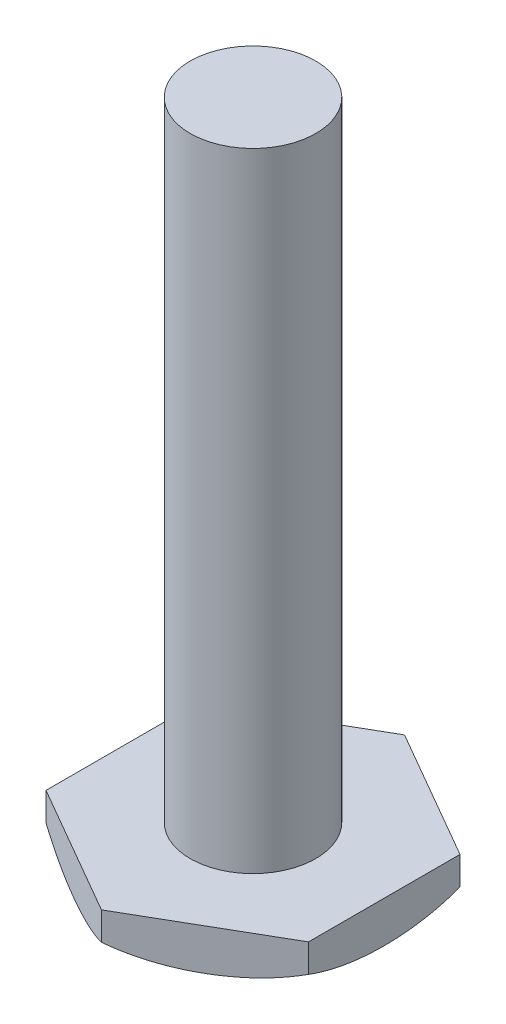
ISO-10303-21;
HEADER;
FILE_DESCRIPTION(('STEP AP214'),'2;1');
FILE_NAME('part.step','',(''),(''),'','','');
FILE_SCHEMA(('AUTOMOTIVE_DESIGN { 1 0 10303 214 1 1 1 1 }'));
ENDSEC;
DATA;
#1=APPLICATION_CONTEXT('core data for automotive mechanical design processes');
#2=APPLICATION_PROTOCOL_DEFINITION('international standard','automotive_design',2000,#1);
#3=PRODUCT_CONTEXT('',#1,'mechanical');
#4=PRODUCT('Part','Part','',(#3));
#5=PRODUCT_RELATED_PRODUCT_CATEGORY('part','',(#4));
#6=PRODUCT_DEFINITION_FORMATION('','',#4);
#7=PRODUCT_DEFINITION_CONTEXT('part definition',#1,'design');
#8=PRODUCT_DEFINITION('design','',#6,#7);
#9=PRODUCT_DEFINITION_SHAPE('','',#8);
#10=(LENGTH_UNIT() NAMED_UNIT(*) SI_UNIT(.MILLI.,.METRE.));
#11=(NAMED_UNIT(*) PLANE_ANGLE_UNIT() SI_UNIT($,.RADIAN.));
#12=(NAMED_UNIT(*) SI_UNIT($,.STERADIAN.) SOLID_ANGLE_UNIT());
#13=UNCERTAINTY_MEASURE_WITH_UNIT(LENGTH_MEASURE(1.E-05),#10,'distance_accuracy_value','');
#14=(GEOMETRIC_REPRESENTATION_CONTEXT(3) GLOBAL_UNCERTAINTY_ASSIGNED_CONTEXT((#13)) GLOBAL_UNIT_ASSIGNED_CONTEXT((#10,
#11,#12)) REPRESENTATION_CONTEXT('',''));
#15=CARTESIAN_POINT('',(0.,0.,0.));
#16=DIRECTION('',(0.,0.,1.));
#17=DIRECTION('',(1.,0.,0.));
#18=AXIS2_PLACEMENT_3D('',#15,#16,#17);
#19=CARTESIAN_POINT('',(4.97289269438832,-14.1867870187384,0.));
#20=DIRECTION('',(0.,1.,0.));
#21=DIRECTION('',(-1.,0.,0.));
#22=AXIS2_PLACEMENT_3D('',#19,#20,#21);
#23=PLANE('',#22);
#24=CARTESIAN_POINT('',(20.2954426943877,-14.1867870187385,0.));
#25=DIRECTION('',(0.,1.,0.));
#26=DIRECTION('',(-1.,0.,0.));
#27=AXIS2_PLACEMENT_3D('',#24,#25,#26);
#28=CIRCLE('',#27,6.34999999999999);
#29=CARTESIAN_POINT('',(13.9454426943877,-14.1867870187384,0.));
#30=VERTEX_POINT('',#29);
#31=EDGE_CURVE('E118',#30,#30,#28,.T.);
#32=ORIENTED_EDGE('',*,*,#31,.F.);
#33=EDGE_LOOP('',(#32));
#34=FACE_BOUND('',#33,.T.);
#35=DIRECTION('',(0.866025403784439,0.,0.499999999999999));
#36=VECTOR('',#35,1.);
#37=CARTESIAN_POINT('',(2.16890478972675,-14.1867870187384,4.85664951468244));
#38=LINE('',#37,#36);
#39=CARTESIAN_POINT('',(7.02619188506488,-14.1867870187385,7.6610055267072));
#40=VERTEX_POINT('',#39);
#41=CARTESIAN_POINT('',(20.2954426943883,-14.1867870187385,15.3220110534147));
#42=VERTEX_POINT('',#41);
#43=EDGE_CURVE('E87',#40,#42,#38,.T.);
#44=ORIENTED_EDGE('',*,*,#43,.T.);
#45=DIRECTION('',(0.866025403784439,0.,-0.5));
#46=VECTOR('',#45,1.);
#47=CARTESIAN_POINT('',(15.4381555990496,-14.1867870187385,18.1263670654392));
#48=LINE('',#47,#46);
#49=CARTESIAN_POINT('',(33.5646935037106,-14.1867870187386,7.66100552670717));
#50=VERTEX_POINT('',#49);
#51=EDGE_CURVE('E116',#42,#50,#48,.T.);
#52=ORIENTED_EDGE('',*,*,#51,.T.);
#53=DIRECTION('',(0.,0.,-1.));
#54=VECTOR('',#53,1.);
#55=CARTESIAN_POINT('',(33.5646935037106,-14.1867870187386,0.));
#56=LINE('',#55,#54);
#57=CARTESIAN_POINT('',(33.5646935037106,-14.1867870187386,-7.66100552670721));
#58=VERTEX_POINT('',#57);
#59=EDGE_CURVE('E113',#50,#58,#56,.T.);
#60=ORIENTED_EDGE('',*,*,#59,.T.);
#61=DIRECTION('',(-0.86602540378444,0.,-0.499999999999997));
#62=VECTOR('',#61,1.);
#63=CARTESIAN_POINT('',(15.4381555990495,-14.1867870187385,-18.1263670654392));
#64=LINE('',#63,#62);
#65=CARTESIAN_POINT('',(20.2954426943877,-14.1867870187385,-15.3220110534144));
#66=VERTEX_POINT('',#65);
#67=EDGE_CURVE('E108',#58,#66,#64,.T.);
#68=ORIENTED_EDGE('',*,*,#67,.T.);
#69=DIRECTION('',(-0.866025403784438,0.,0.500000000000001));
#70=VECTOR('',#69,1.);
#71=CARTESIAN_POINT('',(2.16890478972675,-14.1867870187384,-4.85664951468241));
#72=LINE('',#71,#70);
#73=CARTESIAN_POINT('',(7.02619188506488,-14.1867870187384,-7.66100552670718));
#74=VERTEX_POINT('',#73);
#75=EDGE_CURVE('E106',#66,#74,#72,.T.);
#76=ORIENTED_EDGE('',*,*,#75,.T.);
#77=DIRECTION('',(0.,0.,1.));
#78=VECTOR('',#77,1.);
#79=CARTESIAN_POINT('',(7.02619188506488,-14.1867870187384,0.));
#80=LINE('',#79,#78);
#81=EDGE_CURVE('E92',#74,#40,#80,.T.);
#82=ORIENTED_EDGE('',*,*,#81,.T.);
#83=EDGE_LOOP('',(#44,#52,#60,#68,#76,#82));
#84=FACE_BOUND('',#83,.T.);
#85=ADVANCED_FACE('F34',(#34,#84),#23,.T.);
#86=CARTESIAN_POINT('',(13.9454426943877,49.3132129812616,0.));
#87=DIRECTION('',(0.,1.,0.));
#88=DIRECTION('',(-1.,0.,0.));
#89=AXIS2_PLACEMENT_3D('',#86,#87,#88);
#90=PLANE('',#89);
#91=CARTESIAN_POINT('',(20.2954426943883,49.3132129812615,0.));
#92=DIRECTION('',(0.,1.,0.));
#93=DIRECTION('',(-1.,0.,0.));
#94=AXIS2_PLACEMENT_3D('',#91,#92,#93);
#95=CIRCLE('',#94,6.3500000000006);
#96=CARTESIAN_POINT('',(13.9454426943877,49.3132129812616,0.));
#97=VERTEX_POINT('',#96);
#98=EDGE_CURVE('E121',#97,#97,#95,.T.);
#99=ORIENTED_EDGE('',*,*,#98,.T.);
#100=EDGE_LOOP('',(#99));
#101=FACE_BOUND('',#100,.T.);
#102=ADVANCED_FACE('F154',(#101),#90,.T.);
#103=CARTESIAN_POINT('',(20.2954426943883,49.3132129812616,0.));
#104=DIRECTION('',(0.,1.,0.));
#105=DIRECTION('',(-1.,0.,0.));
#106=AXIS2_PLACEMENT_3D('',#103,#104,#105);
#107=CYLINDRICAL_SURFACE('',#106,6.35000000000007);
#108=ORIENTED_EDGE('',*,*,#31,.T.);
#109=EDGE_LOOP('',(#108));
#110=FACE_BOUND('',#109,.T.);
#111=ORIENTED_EDGE('',*,*,#98,.F.);
#112=EDGE_LOOP('',(#111));
#113=FACE_BOUND('',#112,.T.);
#114=ADVANCED_FACE('F150',(#110,#113),#107,.T.);
#115=CARTESIAN_POINT('',(33.5646935037112,49.3132129812616,7.66100552670717));
#116=DIRECTION('',(0.5,0.,0.866025403784439));
#117=DIRECTION('',(0.866025403784439,0.,-0.5));
#118=AXIS2_PLACEMENT_3D('',#115,#116,#117);
#119=PLANE('',#118);
#120=DIRECTION('',(0.,-1.,0.));
#121=VECTOR('',#120,1.);
#122=CARTESIAN_POINT('',(20.2954426943883,49.3132129812617,15.3220110534144));
#123=LINE('',#122,#121);
#124=CARTESIAN_POINT('',(20.2954426943877,-17.0319966537057,15.3220110534144));
#125=VERTEX_POINT('',#124);
#126=EDGE_CURVE('E52',#42,#125,#123,.T.);
#127=ORIENTED_EDGE('',*,*,#126,.T.);
#128=CARTESIAN_POINT('',(33.5648935037112,-17.0319088909307,7.66089005665297));
#129=CARTESIAN_POINT('',(33.111823366917,-17.2307190477961,7.92247022209291));
#130=CARTESIAN_POINT('',(32.6509930388295,-17.4047294242662,8.18853073606493));
#131=CARTESIAN_POINT('',(31.7186770752691,-17.7061782382809,8.72680360859633));
#132=CARTESIAN_POINT('',(31.2472070464806,-17.8336807093711,8.99900695663221));
#133=CARTESIAN_POINT('',(30.2946661346574,-18.0462385829953,9.54895670848744));
#134=CARTESIAN_POINT('',(29.8135574424734,-18.131063827805,9.82672494142937));
#135=CARTESIAN_POINT('',(28.8471225371761,-18.2602486282798,10.384696394157));
#136=CARTESIAN_POINT('',(28.3617945737427,-18.3045904934179,10.6649006244906));
#137=CARTESIAN_POINT('',(27.3644109215039,-18.3559024314909,11.240740344596));
#138=CARTESIAN_POINT('',(26.852276339606,-18.3608117101938,11.536421383316));
#139=CARTESIAN_POINT('',(25.8289644626214,-18.3280862638972,12.127230770958));
#140=CARTESIAN_POINT('',(25.3177872526707,-18.2904479199188,12.4223590707267));
#141=CARTESIAN_POINT('',(24.3009061515079,-18.1710308689775,13.0094556482168));
#142=CARTESIAN_POINT('',(23.7951900526525,-18.0893923458226,13.3014309740245));
#143=CARTESIAN_POINT('',(22.7912341035226,-17.8788105950527,13.8810652115092));
#144=CARTESIAN_POINT('',(22.292991131774,-17.749887724861,14.1687259253701));
#145=CARTESIAN_POINT('',(21.546124053047,-17.5155147147188,14.599929834322));
#146=CARTESIAN_POINT('',(21.2930399553977,-17.4287473709035,14.7460480062274));
#147=CARTESIAN_POINT('',(20.7909367430956,-17.2410658142445,15.035937431011));
#148=CARTESIAN_POINT('',(20.5419162867765,-17.1401563806084,15.1797094585006));
#149=CARTESIAN_POINT('',(20.2952426943877,-17.0319088909309,15.3221265234682));
#150=B_SPLINE_CURVE_WITH_KNOTS('',3,(#128,#129,#130,#131,#132,#133,#134,#135,#136,#137,#138,
#139,#140,#141,#142,#143,#144,#145,#146,#147,#148,#149),.UNSPECIFIED.,.F.,.F.,(4,2,2,2,2,2,2,2,
2,2,4),(0.,1.67773954982324,3.35316033717958,5.03752230962399,6.72261996692063,8.49524478686033,
10.2680203925355,12.0351810678027,13.8015818152875,14.7157932843279,15.6296965444941),.UNSPECIFIED.);
#151=CARTESIAN_POINT('',(33.5646935037106,-17.0319966536976,7.66100552670717));
#152=VERTEX_POINT('',#151);
#153=EDGE_CURVE('E12',#152,#125,#150,.T.);
#154=ORIENTED_EDGE('',*,*,#153,.F.);
#155=DIRECTION('',(0.,-1.,0.));
#156=VECTOR('',#155,1.);
#157=CARTESIAN_POINT('',(33.5646935037112,49.3132129812616,7.66100552670717));
#158=LINE('',#157,#156);
#159=EDGE_CURVE('E93',#50,#152,#158,.T.);
#160=ORIENTED_EDGE('',*,*,#159,.F.);
#161=ORIENTED_EDGE('',*,*,#51,.F.);
#162=EDGE_LOOP('',(#127,#154,#160,#161));
#163=FACE_BOUND('',#162,.T.);
#164=ADVANCED_FACE('F145',(#163),#119,.T.);
#165=CARTESIAN_POINT('',(33.5646935037112,49.3132129812616,-7.66100552670721));
#166=DIRECTION('',(1.,0.,0.));
#167=DIRECTION('',(0.,1.,0.));
#168=AXIS2_PLACEMENT_3D('',#165,#166,#167);
#169=PLANE('',#168);
#170=ORIENTED_EDGE('',*,*,#159,.T.);
#171=CARTESIAN_POINT('',(33.5646935037106,-18.3538652307431,0.));
#172=CARTESIAN_POINT('',(33.5646935037106,-18.3538686357167,0.598536424461198));
#173=CARTESIAN_POINT('',(33.5646935037106,-18.3321294210898,1.19709922839585));
#174=CARTESIAN_POINT('',(33.5646935037106,-18.2440923495477,2.39104971638389));
#175=CARTESIAN_POINT('',(33.5646935037106,-18.1777878298826,2.98643691224944));
#176=CARTESIAN_POINT('',(33.5646935037106,-17.9978378553961,4.16879992968116));
#177=CARTESIAN_POINT('',(33.5646935037106,-17.8843039146107,4.75579221777713));
#178=CARTESIAN_POINT('',(33.5646935037106,-17.6756740500726,5.62685106902979));
#179=CARTESIAN_POINT('',(33.5646935037106,-17.5997557288037,5.91559320906014));
#180=CARTESIAN_POINT('',(33.5646935037106,-17.4346161303988,6.48933609287663));
#181=CARTESIAN_POINT('',(33.5646935037106,-17.3453917086936,6.77433593489314));
#182=CARTESIAN_POINT('',(33.5646935037106,-17.1084446290652,7.47127577150616));
#183=CARTESIAN_POINT('',(33.5646935037106,-16.952821879466,7.88056788923095));
#184=CARTESIAN_POINT('',(33.5646935037106,-16.6108791475207,8.68603450438351));
#185=CARTESIAN_POINT('',(33.5646935037106,-16.424567005913,9.08221232137504));
#186=CARTESIAN_POINT('',(33.5646935037106,-16.0204880586943,9.85818032879326));
#187=CARTESIAN_POINT('',(33.5646935037106,-15.8027261871143,10.2379730776963));
#188=CARTESIAN_POINT('',(33.5646935037106,-15.3355376149767,10.9776258845504));
#189=CARTESIAN_POINT('',(33.5646935037106,-15.0861103246162,11.3374855710472));
#190=CARTESIAN_POINT('',(33.5646935037106,-14.5539151992156,12.0362876393734));
#191=CARTESIAN_POINT('',(33.5646935037106,-14.2708966407944,12.375039685945));
#192=CARTESIAN_POINT('',(33.5646935037106,-13.6743187698628,13.0245423473983));
#193=CARTESIAN_POINT('',(33.5646935037106,-13.360758555671,13.3352921350475));
#194=CARTESIAN_POINT('',(33.5646935037106,-12.7049641123741,13.9249387903882));
#195=CARTESIAN_POINT('',(33.5646935037106,-12.3627363881232,14.2038428503348));
#196=CARTESIAN_POINT('',(33.5646935037106,-11.8300126830844,14.5954931661809));
#197=CARTESIAN_POINT('',(33.5646935037106,-11.6492058393786,14.7215934468049));
#198=CARTESIAN_POINT('',(33.5646935037106,-11.2814084846498,14.9645630603408));
#199=CARTESIAN_POINT('',(33.5646935037106,-11.094416118217,15.0814295872137));
#200=CARTESIAN_POINT('',(33.5646935037106,-10.5720111938073,15.3896759966035));
#201=CARTESIAN_POINT('',(33.5646935037106,-10.2306346398662,15.5710753534488));
#202=CARTESIAN_POINT('',(33.5646935037107,-9.53290756820259,15.9021691846349));
#203=CARTESIAN_POINT('',(33.5646935037107,-9.17655834408352,16.0518663912446));
#204=CARTESIAN_POINT('',(33.5646935037107,-8.45178474047677,16.3178997779156));
#205=CARTESIAN_POINT('',(33.5646935037107,-8.08336609332564,16.434251546489));
#206=CARTESIAN_POINT('',(33.5646935037107,-7.33734772878062,16.6323734344121));
#207=CARTESIAN_POINT('',(33.5646935037107,-6.95974844467553,16.7141451824609));
#208=CARTESIAN_POINT('',(33.5646935037107,-6.22824164833974,16.8372037643435));
#209=CARTESIAN_POINT('',(33.5646935037107,-5.87477861389079,16.8811470737205));
#210=CARTESIAN_POINT('',(33.5646935037107,-5.16539315132727,16.9384292449644));
#211=CARTESIAN_POINT('',(33.5646935037107,-4.8094708770961,16.9517700046551));
#212=CARTESIAN_POINT('',(33.5646935037107,-4.09786664291392,16.9477203454122));
#213=CARTESIAN_POINT('',(33.5646935037107,-3.74218465172659,16.9303353256955));
#214=CARTESIAN_POINT('',(33.5646935037107,-3.03363620284627,16.865013736492));
#215=CARTESIAN_POINT('',(33.5646935037107,-2.68076974910853,16.817077124094));
#216=CARTESIAN_POINT('',(33.5646935037107,-1.98796514078884,16.6924695091963));
#217=CARTESIAN_POINT('',(33.5646935037107,-1.64791199122469,16.6164363883207));
#218=CARTESIAN_POINT('',(33.5646935037107,-0.975347172333934,16.4362635658281));
#219=CARTESIAN_POINT('',(33.5646935037107,-0.642835330905061,16.3321245063256));
#220=CARTESIAN_POINT('',(33.5646935037107,0.0124059834821114,16.0966925817958));
#221=CARTESIAN_POINT('',(33.5646935037107,0.33513592304754,15.9654010143168));
#222=CARTESIAN_POINT('',(33.5646935037107,0.968758336298564,15.6768360160698));
#223=CARTESIAN_POINT('',(33.5646935037107,1.27965059362848,15.5195621107064));
#224=CARTESIAN_POINT('',(33.5646935037108,1.89306533479723,15.177421940684));
#225=CARTESIAN_POINT('',(33.5646935037108,2.19534367191288,14.9921181551042));
#226=CARTESIAN_POINT('',(33.5646935037108,2.78391102773647,14.5976785116119));
#227=CARTESIAN_POINT('',(33.5646935037108,3.07019999366608,14.3885425750404));
#228=CARTESIAN_POINT('',(33.5646935037108,3.62531555880373,13.9482069080797));
#229=CARTESIAN_POINT('',(33.5646935037108,3.89413992691143,13.7170043679635));
#230=CARTESIAN_POINT('',(33.5646935037108,4.41307180743041,13.2344554111461));
#231=CARTESIAN_POINT('',(33.5646935037108,4.66317756689221,12.9831071123997));
#232=CARTESIAN_POINT('',(33.5646935037108,5.15823446640743,12.4465178221095));
#233=CARTESIAN_POINT('',(33.5646935037108,5.40196018996119,12.1601465064897));
#234=CARTESIAN_POINT('',(33.5646935037108,5.86650160543554,11.5694244323249));
#235=CARTESIAN_POINT('',(33.5646935037108,6.08731699382837,11.2650734356598));
#236=CARTESIAN_POINT('',(33.5646935037108,6.50560607453523,10.6408531955916));
#237=CARTESIAN_POINT('',(33.5646935037108,6.7030847830746,10.3209873080441));
#238=CARTESIAN_POINT('',(33.5646935037108,7.07474800124408,9.6679763629918));
#239=CARTESIAN_POINT('',(33.5646935037108,7.24892812282767,9.3348288193188));
#240=CARTESIAN_POINT('',(33.5646935037108,7.64042659330087,8.5196939903488));
#241=CARTESIAN_POINT('',(33.5646935037108,7.84648564361528,8.03226959963395));
#242=CARTESIAN_POINT('',(33.5646935037108,8.21475203770081,7.04111930821335));
#243=CARTESIAN_POINT('',(33.5646935037108,8.37694445200691,6.53738792276917));
#244=CARTESIAN_POINT('',(33.5646935037108,8.66039644623737,5.51689072574765));
#245=CARTESIAN_POINT('',(33.5646935037108,8.78152281602344,5.00008823042994));
#246=CARTESIAN_POINT('',(33.5646935037108,8.98496604700008,3.95881813879884));
#247=CARTESIAN_POINT('',(33.5646935037108,9.06727292648125,3.43434860675248));
#248=CARTESIAN_POINT('',(33.5646935037108,9.17204702624804,2.57392180098535));
#249=CARTESIAN_POINT('',(33.5646935037108,9.20539004028484,2.23923489244435));
#250=CARTESIAN_POINT('',(33.5646935037108,9.25792843017189,1.56882641378676));
#251=CARTESIAN_POINT('',(33.5646935037108,9.27712735357801,1.23310512433661));
#252=CARTESIAN_POINT('',(33.5646935037108,9.30169083667311,0.560998979671739));
#253=CARTESIAN_POINT('',(33.5646935037108,9.30704862172637,0.224613880129424));
#254=CARTESIAN_POINT('',(33.5646935037108,9.30399537901971,-0.448113081433974));
#255=CARTESIAN_POINT('',(33.5646935037108,9.295583511766,-0.784454939568472));
#256=CARTESIAN_POINT('',(33.5646935037108,9.26487645998682,-1.45606121586108));
#257=CARTESIAN_POINT('',(33.5646935037108,9.24260011611766,-1.79132647657691));
#258=CARTESIAN_POINT('',(33.5646935037108,9.1838485024483,-2.46057901330732));
#259=CARTESIAN_POINT('',(33.5646935037108,9.14737316778244,-2.79456628347657));
#260=CARTESIAN_POINT('',(33.5646935037108,9.01593859937922,-3.79332688396694));
#261=CARTESIAN_POINT('',(33.5646935037108,8.89894765948305,-4.45543971903742));
#262=CARTESIAN_POINT('',(33.5646935037108,8.64534072087922,-5.57002725888335));
#263=CARTESIAN_POINT('',(33.5646935037108,8.52492902219822,-6.02624459678219));
#264=CARTESIAN_POINT('',(33.5646935037108,8.25054754704098,-6.92855326604348));
#265=CARTESIAN_POINT('',(33.5646935037108,8.09658049576811,-7.37464541647799));
#266=CARTESIAN_POINT('',(33.5646935037108,7.75374887150279,-8.25229184582183));
#267=CARTESIAN_POINT('',(33.5646935037108,7.56495128939707,-8.68387218325877));
#268=CARTESIAN_POINT('',(33.5646935037108,7.15111909144505,-9.52933640342705));
#269=CARTESIAN_POINT('',(33.5646935037108,6.92608956329819,-9.9432227604405));
#270=CARTESIAN_POINT('',(33.5646935037108,6.47661547749917,-10.6872586313547));
#271=CARTESIAN_POINT('',(33.5646935037108,6.25734183311412,-11.0205358032327));
#272=CARTESIAN_POINT('',(33.5646935037108,5.79271393064596,-11.6684034126403));
#273=CARTESIAN_POINT('',(33.5646935037108,5.54736199260084,-11.9829955085999));
#274=CARTESIAN_POINT('',(33.5646935037108,5.03113196607568,-12.590744489258));
#275=CARTESIAN_POINT('',(33.5646935037108,4.76024374164193,-12.8838927797165));
#276=CARTESIAN_POINT('',(33.5646935037108,4.19416087973489,-13.4457537402505));
#277=CARTESIAN_POINT('',(33.5646935037108,3.89896579450524,-13.7144659599974));
#278=CARTESIAN_POINT('',(33.5646935037108,3.28445942644948,-14.2258587032592));
#279=CARTESIAN_POINT('',(33.5646935037108,2.96504225589781,-14.4684121952282));
#280=CARTESIAN_POINT('',(33.5646935037108,2.30539694978118,-14.923402176687));
#281=CARTESIAN_POINT('',(33.5646935037108,1.96516844152958,-15.1358381266099));
#282=CARTESIAN_POINT('',(33.5646935037107,1.26653673309502,-15.5281234133242));
#283=CARTESIAN_POINT('',(33.5646935037107,0.908139170262971,-15.7079827794749));
#284=CARTESIAN_POINT('',(33.5646935037107,0.175982756477517,-16.0330909916295));
#285=CARTESIAN_POINT('',(33.5646935037107,-0.197774737861842,-16.1783428865514));
#286=CARTESIAN_POINT('',(33.5646935037107,-0.923652353853563,-16.421220462349));
#287=CARTESIAN_POINT('',(33.5646935037107,-1.27474327026334,-16.5219316142179));
#288=CARTESIAN_POINT('',(33.5646935037107,-1.98439409221795,-16.6921981540395));
#289=CARTESIAN_POINT('',(33.5646935037107,-2.34295353474119,-16.7617554674366));
#290=CARTESIAN_POINT('',(33.5646935037107,-3.06471447435139,-16.8689984841744));
#291=CARTESIAN_POINT('',(33.5646935037107,-3.42791477156652,-16.906692262955));
#292=CARTESIAN_POINT('',(33.5646935037107,-4.15622619969678,-16.9498534358142));
#293=CARTESIAN_POINT('',(33.5646935037107,-4.52133730045606,-16.9553213369483));
#294=CARTESIAN_POINT('',(33.5646935037107,-5.23541787460046,-16.9344230216578));
#295=CARTESIAN_POINT('',(33.5646935037107,-5.58442659003232,-16.9093725296346));
#296=CARTESIAN_POINT('',(33.5646935037107,-6.27906687074201,-16.8298632318285));
#297=CARTESIAN_POINT('',(33.5646935037107,-6.62469855803049,-16.7754054925474));
#298=CARTESIAN_POINT('',(33.5646935037107,-7.31011194821929,-16.6375975894255));
#299=CARTESIAN_POINT('',(33.5646935037107,-7.64989422759544,-16.5542502900424));
#300=CARTESIAN_POINT('',(33.5646935037107,-8.3212964369068,-16.3594332217398));
#301=CARTESIAN_POINT('',(33.5646935037107,-8.65291627487894,-16.2479631361307));
#302=CARTESIAN_POINT('',(33.5646935037107,-9.30616506756049,-15.9977677210426));
#303=CARTESIAN_POINT('',(33.5646935037106,-9.62778135325463,-15.8590093396718));
#304=CARTESIAN_POINT('',(33.5646935037106,-10.258532104373,-15.5555758411555));
#305=CARTESIAN_POINT('',(33.5646935037106,-10.567666654243,-15.3909008993867));
#306=CARTESIAN_POINT('',(33.5646935037106,-11.1716065919846,-15.0370757640882));
#307=CARTESIAN_POINT('',(33.5646935037106,-11.466411174087,-14.8479241964312));
#308=CARTESIAN_POINT('',(33.5646935037106,-12.0400346704792,-14.4467761537957));
#309=CARTESIAN_POINT('',(33.5646935037106,-12.3188531743581,-14.2347790927065));
#310=CARTESIAN_POINT('',(33.5646935037106,-12.8699515255231,-13.7807677398608));
#311=CARTESIAN_POINT('',(33.5646935037106,-13.1415200979554,-13.5378903212072));
#312=CARTESIAN_POINT('',(33.5646935037106,-13.6645836457236,-13.0314291871162));
#313=CARTESIAN_POINT('',(33.5646935037106,-13.9160782393843,-12.7678450781625));
#314=CARTESIAN_POINT('',(33.5646935037106,-14.3980620042943,-12.2221373764789));
#315=CARTESIAN_POINT('',(33.5646935037106,-14.6285505980471,-11.9400132744145));
#316=CARTESIAN_POINT('',(33.5646935037106,-15.0679287497493,-11.3594053311714));
#317=CARTESIAN_POINT('',(33.5646935037106,-15.2768158178474,-11.0609196101606));
#318=CARTESIAN_POINT('',(33.5646935037106,-15.6911064111739,-10.42134088437));
#319=CARTESIAN_POINT('',(33.5646935037106,-15.894378201076,-10.0788673413027));
#320=CARTESIAN_POINT('',(33.5646935037106,-16.2748023016153,-9.37974041244953));
#321=CARTESIAN_POINT('',(33.5646935037106,-16.4519533905584,-9.02308636441561));
#322=CARTESIAN_POINT('',(33.5646935037106,-16.7806140356836,-8.29812928205038));
#323=CARTESIAN_POINT('',(33.5646935037106,-16.9321201720629,-7.92982470185879));
#324=CARTESIAN_POINT('',(33.5646935037106,-17.2103074523413,-7.18383432578998));
#325=CARTESIAN_POINT('',(33.5646935037106,-17.3369779368396,-6.80614457984017));
#326=CARTESIAN_POINT('',(33.5646935037106,-17.6078746043486,-5.90597431700419));
#327=CARTESIAN_POINT('',(33.5646935037106,-17.741943284025,-5.38042323794859));
#328=CARTESIAN_POINT('',(33.5646935037106,-17.9688222905391,-4.3206578794397));
#329=CARTESIAN_POINT('',(33.5646935037106,-18.0616341930543,-3.78644393164622));
#330=CARTESIAN_POINT('',(33.5646935037106,-18.2090424210446,-2.71139794763836));
#331=CARTESIAN_POINT('',(33.5646935037106,-18.2635380816162,-2.17055224866578));
#332=CARTESIAN_POINT('',(33.5646935037106,-18.3359476242766,-1.08647824923966));
#333=CARTESIAN_POINT('',(33.5646935037106,-18.3538621402848,-0.543249990237302));
#334=CARTESIAN_POINT('',(33.5646935037106,-18.3538652307431,0.));
#335=B_SPLINE_CURVE_WITH_KNOTS('',3,(#171,#172,#173,#174,#175,#176,#177,#178,#179,#180,#181,
#182,#183,#184,#185,#186,#187,#188,#189,#190,#191,#192,#193,#194,#195,#196,#197,#198,#199,#200,
#201,#202,#203,#204,#205,#206,#207,#208,#209,#210,#211,#212,#213,#214,#215,#216,#217,#218,#219,
#220,#221,#222,#223,#224,#225,#226,#227,#228,#229,#230,#231,#232,#233,#234,#235,#236,#237,#238,
#239,#240,#241,#242,#243,#244,#245,#246,#247,#248,#249,#250,#251,#252,#253,#254,#255,#256,#257,
#258,#259,#260,#261,#262,#263,#264,#265,#266,#267,#268,#269,#270,#271,#272,#273,#274,#275,#276,
#277,#278,#279,#280,#281,#282,#283,#284,#285,#286,#287,#288,#289,#290,#291,#292,#293,#294,#295,
#296,#297,#298,#299,#300,#301,#302,#303,#304,#305,#306,#307,#308,#309,#310,#311,#312,#313,#314,
#315,#316,#317,#318,#319,#320,#321,#322,#323,#324,#325,#326,#327,#328,#329,#330,#331,#332,#333,
#334),.UNSPECIFIED.,.T.,.F.,(4,2,2,2,2,2,2,2,2,2,2,2,2,2,2,2,2,2,2,2,2,2,2,2,2,2,2,2,2,2,2,2,2,
2,2,2,2,2,2,2,2,2,2,2,2,2,2,2,2,2,2,2,2,2,2,2,2,2,2,2,2,2,2,2,2,2,2,2,2,2,2,2,2,2,2,2,2,2,2,2,2,
4),(0.,1.79523432150026,3.59073709978553,5.38202433986365,6.27742075465304,7.17302911065157,
8.48542554480884,9.79748719742142,11.1093432287279,12.4212236983682,13.743597529803,
15.0660104135257,16.3881240413306,17.0491941966054,17.7104644774832,18.8685268490261,
20.0264893716089,21.1839096770625,22.3412754626071,23.408527282353,24.475712914455,
25.5427110364617,26.6097106571232,27.6538413916308,28.6979482737169,29.7420052721599,
30.7860813435373,31.8485621562608,32.911046475855,33.9736662618724,35.0363854353027,
36.1633424594927,37.2903144122764,38.4170436798175,39.543984857197,41.1291771993337,
42.7149083650508,44.3057351865105,45.8969708367704,46.9057327248981,47.9142415137806,
48.9232438304461,49.9323076652032,50.9400032521473,51.9477034426296,53.9614853026886,
55.3759094825078,56.7902188324186,58.2018358219369,59.6132547644194,60.8088776247983,
62.0043942062762,63.2003873306752,64.3964024913778,65.5979864132909,66.7995918593108,
68.0008267356628,69.2019557440636,70.2963343074963,71.3906452241783,72.4846787173515,
73.5786949964999,74.6271692511938,75.6756054838166,76.7239377916083,77.7722819051517,
78.8219036933488,79.8715183790864,80.9211920161801,81.9708925895086,83.0627127290843,
84.1545536229659,85.246424524664,86.3384211384701,87.5320018472324,88.7256383634004,
89.9194339280643,91.1137407505997,92.7389868086816,94.3641707900818,95.9936086799631,
97.6230183328619),.UNSPECIFIED.);
#336=CARTESIAN_POINT('',(33.5646935037106,-17.0319966536976,-7.66100552670721));
#337=VERTEX_POINT('',#336);
#338=EDGE_CURVE('E45',#337,#152,#335,.T.);
#339=ORIENTED_EDGE('',*,*,#338,.F.);
#340=DIRECTION('',(0.,-1.,0.));
#341=VECTOR('',#340,1.);
#342=CARTESIAN_POINT('',(33.5646935037112,49.3132129812616,-7.66100552670721));
#343=LINE('',#342,#341);
#344=EDGE_CURVE('E270',#58,#337,#343,.T.);
#345=ORIENTED_EDGE('',*,*,#344,.F.);
#346=ORIENTED_EDGE('',*,*,#59,.F.);
#347=EDGE_LOOP('',(#170,#339,#345,#346));
#348=FACE_BOUND('',#347,.T.);
#349=ADVANCED_FACE('F149',(#348),#169,.T.);
#350=CARTESIAN_POINT('',(20.2954426943883,49.3132129812617,-15.3220110534144));
#351=DIRECTION('',(0.499999999999997,0.,-0.86602540378444));
#352=DIRECTION('',(-0.86602540378444,0.,-0.499999999999997));
#353=AXIS2_PLACEMENT_3D('',#350,#351,#352);
#354=PLANE('',#353);
#355=ORIENTED_EDGE('',*,*,#344,.T.);
#356=CARTESIAN_POINT('',(20.2952426943877,-17.0319088909309,-15.3221265234682));
#357=CARTESIAN_POINT('',(20.7483128311819,-17.2307190477962,-15.0605463580283));
#358=CARTESIAN_POINT('',(21.2091431592694,-17.4047294242664,-14.7944858440563));
#359=CARTESIAN_POINT('',(22.1414591228299,-17.706178238281,-14.2562129715248));
#360=CARTESIAN_POINT('',(22.6129291516184,-17.8336807093712,-13.9840096234889));
#361=CARTESIAN_POINT('',(23.5654700634416,-18.0462385829954,-13.4340598716337));
#362=CARTESIAN_POINT('',(24.0465787556257,-18.1310638278051,-13.1562916386917));
#363=CARTESIAN_POINT('',(25.013013660923,-18.2602486282799,-12.5983201859641));
#364=CARTESIAN_POINT('',(25.4983416243564,-18.3045904934179,-12.3181159556305));
#365=CARTESIAN_POINT('',(26.4957252765953,-18.3559024314909,-11.7422762355251));
#366=CARTESIAN_POINT('',(27.0078598584932,-18.3608117101938,-11.446595196805));
#367=CARTESIAN_POINT('',(28.0311717354779,-18.3280862638972,-10.855785809163));
#368=CARTESIAN_POINT('',(28.5423489454286,-18.2904479199188,-10.5606575093943));
#369=CARTESIAN_POINT('',(29.5592300465914,-18.1710308689774,-9.97356093190415));
#370=CARTESIAN_POINT('',(30.0649461454468,-18.0893923458224,-9.68158560609645));
#371=CARTESIAN_POINT('',(31.0689020945768,-17.8788105950525,-9.10195136861174));
#372=CARTESIAN_POINT('',(31.5671450663254,-17.7498877248607,-8.81429065475087));
#373=CARTESIAN_POINT('',(32.3140121450523,-17.5155147147185,-8.38308674579902));
#374=CARTESIAN_POINT('',(32.5670962427015,-17.4287473709032,-8.23696857389364));
#375=CARTESIAN_POINT('',(33.0691994550034,-17.2410658142443,-7.94707914911014));
#376=CARTESIAN_POINT('',(33.3182199113224,-17.1401563806082,-7.80330712162064));
#377=CARTESIAN_POINT('',(33.5648935037112,-17.0319088909307,-7.66089005665301));
#378=B_SPLINE_CURVE_WITH_KNOTS('',3,(#356,#357,#358,#359,#360,#361,#362,#363,#364,#365,#366,
#367,#368,#369,#370,#371,#372,#373,#374,#375,#376,#377),.UNSPECIFIED.,.F.,.F.,(4,2,2,2,2,2,2,2,
2,2,4),(0.,1.67773954982331,3.35316033717971,5.03752230962419,6.72261996692092,8.4952447868607,
10.2680203925359,12.0351810678033,13.8015818152881,14.7157932843282,15.6296965444941),.UNSPECIFIED.);
#379=CARTESIAN_POINT('',(20.2954426943877,-17.0319966536975,-15.3220110534144));
#380=VERTEX_POINT('',#379);
#381=EDGE_CURVE('E257',#380,#337,#378,.T.);
#382=ORIENTED_EDGE('',*,*,#381,.F.);
#383=DIRECTION('',(0.,-1.,0.));
#384=VECTOR('',#383,1.);
#385=CARTESIAN_POINT('',(20.2954426943883,49.3132129812617,-15.3220110534144));
#386=LINE('',#385,#384);
#387=EDGE_CURVE('E273',#66,#380,#386,.T.);
#388=ORIENTED_EDGE('',*,*,#387,.F.);
#389=ORIENTED_EDGE('',*,*,#67,.F.);
#390=EDGE_LOOP('',(#355,#382,#388,#389));
#391=FACE_BOUND('',#390,.T.);
#392=ADVANCED_FACE('F190',(#391),#354,.T.);
#393=CARTESIAN_POINT('',(7.02619188506549,49.3132129812618,-7.66100552670718));
#394=DIRECTION('',(-0.500000000000001,0.,-0.866025403784438));
#395=DIRECTION('',(-0.866025403784438,0.,0.500000000000001));
#396=AXIS2_PLACEMENT_3D('',#393,#394,#395);
#397=PLANE('',#396);
#398=ORIENTED_EDGE('',*,*,#387,.T.);
#399=CARTESIAN_POINT('',(7.02599188506484,-17.0319088909307,-7.66089005665333));
#400=CARTESIAN_POINT('',(7.47906202185911,-17.2307190477961,-7.92247022209329));
#401=CARTESIAN_POINT('',(7.93989234994656,-17.4047294242663,-8.18853073606532));
#402=CARTESIAN_POINT('',(8.87220831350704,-17.7061782382809,-8.72680360859675));
#403=CARTESIAN_POINT('',(9.34367834229556,-17.8336807093711,-8.99900695663265));
#404=CARTESIAN_POINT('',(10.2962192541188,-18.0462385829953,-9.54895670848791));
#405=CARTESIAN_POINT('',(10.7773279463028,-18.1310638278049,-9.82672494142985));
#406=CARTESIAN_POINT('',(11.7437628516002,-18.2602486282798,-10.3846963941575));
#407=CARTESIAN_POINT('',(12.2290908150336,-18.3045904934178,-10.6649006244911));
#408=CARTESIAN_POINT('',(13.2264744672725,-18.3559024314908,-11.2407403445965));
#409=CARTESIAN_POINT('',(13.7386090491704,-18.3608117101937,-11.5364213833166));
#410=CARTESIAN_POINT('',(14.761920926155,-18.3280862638971,-12.1272307709586));
#411=CARTESIAN_POINT('',(15.2730981361058,-18.2904479199186,-12.4223590707273));
#412=CARTESIAN_POINT('',(16.2899792372686,-18.1710308689773,-13.0094556482175));
#413=CARTESIAN_POINT('',(16.795695336124,-18.0893923458223,-13.3014309740252));
#414=CARTESIAN_POINT('',(17.799651285254,-17.8788105950524,-13.8810652115099));
#415=CARTESIAN_POINT('',(18.2978942570025,-17.7498877248606,-14.1687259253708));
#416=CARTESIAN_POINT('',(19.0447613357294,-17.5155147147184,-14.5999298343226));
#417=CARTESIAN_POINT('',(19.2978454333786,-17.4287473709031,-14.746048006228));
#418=CARTESIAN_POINT('',(19.7999486456805,-17.2410658142442,-15.0359374310115));
#419=CARTESIAN_POINT('',(20.0489691019995,-17.1401563806081,-15.179709458501));
#420=CARTESIAN_POINT('',(20.2956426943883,-17.0319088909306,-15.3221265234686));
#421=B_SPLINE_CURVE_WITH_KNOTS('',3,(#399,#400,#401,#402,#403,#404,#405,#406,#407,#408,#409,
#410,#411,#412,#413,#414,#415,#416,#417,#418,#419,#420),.UNSPECIFIED.,.F.,.F.,(4,2,2,2,2,2,2,2,
2,2,4),(0.,1.67773954982331,3.35316033717972,5.0375223096242,6.72261996692092,8.49524478686071,
10.268020392536,12.0351810678033,13.8015818152881,14.7157932843282,15.629696544494),.UNSPECIFIED.);
#422=CARTESIAN_POINT('',(7.02619188506486,-17.0319966537034,-7.66100552670718));
#423=VERTEX_POINT('',#422);
#424=EDGE_CURVE('E251',#423,#380,#421,.T.);
#425=ORIENTED_EDGE('',*,*,#424,.F.);
#426=DIRECTION('',(0.,-1.,0.));
#427=VECTOR('',#426,1.);
#428=CARTESIAN_POINT('',(7.02619188506549,49.3132129812618,-7.66100552670718));
#429=LINE('',#428,#427);
#430=EDGE_CURVE('E102',#74,#423,#429,.T.);
#431=ORIENTED_EDGE('',*,*,#430,.F.);
#432=ORIENTED_EDGE('',*,*,#75,.F.);
#433=EDGE_LOOP('',(#398,#425,#431,#432));
#434=FACE_BOUND('',#433,.T.);
#435=ADVANCED_FACE('F198',(#434),#397,.T.);
#436=CARTESIAN_POINT('',(7.02619188506549,49.3132129812618,7.6610055267072));
#437=DIRECTION('',(-1.,0.,0.));
#438=DIRECTION('',(0.,-1.,0.));
#439=AXIS2_PLACEMENT_3D('',#436,#437,#438);
#440=PLANE('',#439);
#441=ORIENTED_EDGE('',*,*,#430,.T.);
#442=CARTESIAN_POINT('',(7.02619188506484,-18.3538652307429,0.));
#443=CARTESIAN_POINT('',(7.02619188506484,-18.3538686357164,-0.598536424461206));
#444=CARTESIAN_POINT('',(7.02619188506485,-18.3321294210896,-1.19709922839585));
#445=CARTESIAN_POINT('',(7.02619188506485,-18.2440923495475,-2.39104971638388));
#446=CARTESIAN_POINT('',(7.02619188506485,-18.1777878298824,-2.98643691224943));
#447=CARTESIAN_POINT('',(7.02619188506485,-17.9978378553959,-4.16879992968114));
#448=CARTESIAN_POINT('',(7.02619188506485,-17.8843039146105,-4.75579221777712));
#449=CARTESIAN_POINT('',(7.02619188506485,-17.6756740500724,-5.62685106902977));
#450=CARTESIAN_POINT('',(7.02619188506485,-17.5997557288035,-5.91559320906011));
#451=CARTESIAN_POINT('',(7.02619188506485,-17.4346161303986,-6.4893360928766));
#452=CARTESIAN_POINT('',(7.02619188506485,-17.3453917086934,-6.77433593489311));
#453=CARTESIAN_POINT('',(7.02619188506486,-17.108444629065,-7.47127577150613));
#454=CARTESIAN_POINT('',(7.02619188506486,-16.9528218794658,-7.88056788923092));
#455=CARTESIAN_POINT('',(7.02619188506486,-16.6108791475205,-8.68603450438349));
#456=CARTESIAN_POINT('',(7.02619188506486,-16.4245670059128,-9.08221232137502));
#457=CARTESIAN_POINT('',(7.02619188506487,-16.0204880586941,-9.85818032879324));
#458=CARTESIAN_POINT('',(7.02619188506487,-15.8027261871141,-10.2379730776963));
#459=CARTESIAN_POINT('',(7.02619188506487,-15.3355376149765,-10.9776258845504));
#460=CARTESIAN_POINT('',(7.02619188506488,-15.086110324616,-11.3374855710472));
#461=CARTESIAN_POINT('',(7.02619188506488,-14.5539151992154,-12.0362876393733));
#462=CARTESIAN_POINT('',(7.02619188506488,-14.2708966407942,-12.375039685945));
#463=CARTESIAN_POINT('',(7.02619188506489,-13.6743187698626,-13.0245423473983));
#464=CARTESIAN_POINT('',(7.02619188506489,-13.3607585556708,-13.3352921350475));
#465=CARTESIAN_POINT('',(7.0261918850649,-12.7049641123739,-13.9249387903882));
#466=CARTESIAN_POINT('',(7.0261918850649,-12.362736388123,-14.2038428503348));
#467=CARTESIAN_POINT('',(7.02619188506491,-11.8300126830842,-14.5954931661809));
#468=CARTESIAN_POINT('',(7.02619188506491,-11.6492058393784,-14.7215934468049));
#469=CARTESIAN_POINT('',(7.02619188506491,-11.2814084846497,-14.9645630603408));
#470=CARTESIAN_POINT('',(7.02619188506491,-11.0944161182168,-15.0814295872137));
#471=CARTESIAN_POINT('',(7.02619188506492,-10.5720111938071,-15.3896759966035));
#472=CARTESIAN_POINT('',(7.02619188506492,-10.2306346398661,-15.5710753534488));
#473=CARTESIAN_POINT('',(7.02619188506493,-9.5329075682024,-15.9021691846349));
#474=CARTESIAN_POINT('',(7.02619188506493,-9.17655834408334,-16.0518663912447));
#475=CARTESIAN_POINT('',(7.02619188506494,-8.45178474047658,-16.3178997779157));
#476=CARTESIAN_POINT('',(7.02619188506494,-8.08336609332545,-16.4342515464891));
#477=CARTESIAN_POINT('',(7.02619188506495,-7.33734772878043,-16.6323734344121));
#478=CARTESIAN_POINT('',(7.02619188506495,-6.95974844467534,-16.714145182461));
#479=CARTESIAN_POINT('',(7.02619188506496,-6.22824164833955,-16.8372037643435));
#480=CARTESIAN_POINT('',(7.02619188506496,-5.8747786138906,-16.8811470737205));
#481=CARTESIAN_POINT('',(7.02619188506497,-5.16539315132707,-16.9384292449644));
#482=CARTESIAN_POINT('',(7.02619188506497,-4.8094708770959,-16.9517700046552));
#483=CARTESIAN_POINT('',(7.02619188506498,-4.09786664291372,-16.9477203454123));
#484=CARTESIAN_POINT('',(7.02619188506498,-3.74218465172639,-16.9303353256956));
#485=CARTESIAN_POINT('',(7.02619188506499,-3.03363620284606,-16.8650137364921));
#486=CARTESIAN_POINT('',(7.02619188506499,-2.68076974910833,-16.817077124094));
#487=CARTESIAN_POINT('',(7.026191885065,-1.98796514078863,-16.6924695091964));
#488=CARTESIAN_POINT('',(7.026191885065,-1.64791199122448,-16.6164363883208));
#489=CARTESIAN_POINT('',(7.02619188506501,-0.975347172333721,-16.4362635658282));
#490=CARTESIAN_POINT('',(7.02619188506501,-0.642835330904847,-16.3321245063256));
#491=CARTESIAN_POINT('',(7.02619188506502,0.0124059834823302,-16.0966925817959));
#492=CARTESIAN_POINT('',(7.02619188506502,0.335135923047763,-15.9654010143168));
#493=CARTESIAN_POINT('',(7.02619188506503,0.968758336298789,-15.6768360160698));
#494=CARTESIAN_POINT('',(7.02619188506503,1.27965059362871,-15.5195621107065));
#495=CARTESIAN_POINT('',(7.02619188506504,1.89306533479746,-15.1774219406841));
#496=CARTESIAN_POINT('',(7.02619188506504,2.1953436719131,-14.9921181551042));
#497=CARTESIAN_POINT('',(7.02619188506505,2.7839110277367,-14.597678511612));
#498=CARTESIAN_POINT('',(7.02619188506505,3.07019999366632,-14.3885425750405));
#499=CARTESIAN_POINT('',(7.02619188506505,3.62531555880396,-13.9482069080798));
#500=CARTESIAN_POINT('',(7.02619188506506,3.89413992691166,-13.7170043679636));
#501=CARTESIAN_POINT('',(7.02619188506506,4.41307180743064,-13.2344554111462));
#502=CARTESIAN_POINT('',(7.02619188506506,4.66317756689245,-12.9831071123998));
#503=CARTESIAN_POINT('',(7.02619188506507,5.15823446640767,-12.4465178221096));
#504=CARTESIAN_POINT('',(7.02619188506507,5.40196018996143,-12.1601465064898));
#505=CARTESIAN_POINT('',(7.02619188506507,5.86650160543579,-11.569424432325));
#506=CARTESIAN_POINT('',(7.02619188506508,6.08731699382862,-11.2650734356599));
#507=CARTESIAN_POINT('',(7.02619188506508,6.50560607453549,-10.6408531955917));
#508=CARTESIAN_POINT('',(7.02619188506508,6.70308478307485,-10.3209873080442));
#509=CARTESIAN_POINT('',(7.02619188506509,7.07474800124433,-9.66797636299188));
#510=CARTESIAN_POINT('',(7.02619188506509,7.24892812282792,-9.33482881931888));
#511=CARTESIAN_POINT('',(7.02619188506509,7.64042659330113,-8.51969399034888));
#512=CARTESIAN_POINT('',(7.02619188506509,7.84648564361555,-8.03226959963404));
#513=CARTESIAN_POINT('',(7.0261918850651,8.21475203770108,-7.04111930821343));
#514=CARTESIAN_POINT('',(7.0261918850651,8.37694445200718,-6.53738792276927));
#515=CARTESIAN_POINT('',(7.0261918850651,8.66039644623764,-5.51689072574775));
#516=CARTESIAN_POINT('',(7.0261918850651,8.78152281602372,-5.00008823043003));
#517=CARTESIAN_POINT('',(7.0261918850651,8.98496604700036,-3.95881813879893));
#518=CARTESIAN_POINT('',(7.02619188506511,9.06727292648153,-3.43434860675257));
#519=CARTESIAN_POINT('',(7.02619188506511,9.17204702624832,-2.57392180098543));
#520=CARTESIAN_POINT('',(7.02619188506511,9.20539004028512,-2.23923489244444));
#521=CARTESIAN_POINT('',(7.02619188506511,9.25792843017217,-1.56882641378684));
#522=CARTESIAN_POINT('',(7.02619188506511,9.2771273535783,-1.23310512433669));
#523=CARTESIAN_POINT('',(7.02619188506511,9.30169083667341,-0.560998979671814));
#524=CARTESIAN_POINT('',(7.02619188506511,9.30704862172666,-0.224613880129497));
#525=CARTESIAN_POINT('',(7.02619188506511,9.30399537902,0.448113081433905));
#526=CARTESIAN_POINT('',(7.02619188506511,9.29558351176629,0.784454939568406));
#527=CARTESIAN_POINT('',(7.02619188506511,9.26487645998711,1.45606121586102));
#528=CARTESIAN_POINT('',(7.02619188506511,9.24260011611796,1.79132647657686));
#529=CARTESIAN_POINT('',(7.02619188506511,9.18384850244859,2.46057901330727));
#530=CARTESIAN_POINT('',(7.02619188506511,9.14737316778273,2.79456628347652));
#531=CARTESIAN_POINT('',(7.0261918850651,9.01593859937952,3.79332688396689));
#532=CARTESIAN_POINT('',(7.0261918850651,8.89894765948335,4.45543971903738));
#533=CARTESIAN_POINT('',(7.0261918850651,8.64534072087952,5.57002725888332));
#534=CARTESIAN_POINT('',(7.0261918850651,8.52492902219852,6.02624459678216));
#535=CARTESIAN_POINT('',(7.0261918850651,8.25054754704128,6.92855326604346));
#536=CARTESIAN_POINT('',(7.0261918850651,8.09658049576842,7.37464541647797));
#537=CARTESIAN_POINT('',(7.02619188506509,7.7537488715031,8.25229184582181));
#538=CARTESIAN_POINT('',(7.02619188506509,7.56495128939738,8.68387218325875));
#539=CARTESIAN_POINT('',(7.02619188506509,7.15111909144536,9.52933640342703));
#540=CARTESIAN_POINT('',(7.02619188506509,6.9260895632985,9.94322276044048));
#541=CARTESIAN_POINT('',(7.02619188506508,6.47661547749948,10.6872586313547));
#542=CARTESIAN_POINT('',(7.02619188506508,6.25734183311444,11.0205358032327));
#543=CARTESIAN_POINT('',(7.02619188506507,5.79271393064627,11.6684034126403));
#544=CARTESIAN_POINT('',(7.02619188506507,5.54736199260115,11.9829955085999));
#545=CARTESIAN_POINT('',(7.02619188506507,5.03113196607599,12.590744489258));
#546=CARTESIAN_POINT('',(7.02619188506506,4.76024374164224,12.8838927797165));
#547=CARTESIAN_POINT('',(7.02619188506506,4.19416087973521,13.4457537402505));
#548=CARTESIAN_POINT('',(7.02619188506506,3.89896579450556,13.7144659599974));
#549=CARTESIAN_POINT('',(7.02619188506505,3.2844594264498,14.2258587032593));
#550=CARTESIAN_POINT('',(7.02619188506505,2.96504225589813,14.4684121952282));
#551=CARTESIAN_POINT('',(7.02619188506504,2.30539694978151,14.923402176687));
#552=CARTESIAN_POINT('',(7.02619188506504,1.96516844152991,15.1358381266099));
#553=CARTESIAN_POINT('',(7.02619188506503,1.26653673309535,15.5281234133242));
#554=CARTESIAN_POINT('',(7.02619188506503,0.908139170263296,15.7079827794749));
#555=CARTESIAN_POINT('',(7.02619188506502,0.175982756477839,16.0330909916295));
#556=CARTESIAN_POINT('',(7.02619188506502,-0.197774737861521,16.1783428865515));
#557=CARTESIAN_POINT('',(7.02619188506501,-0.923652353853243,16.421220462349));
#558=CARTESIAN_POINT('',(7.02619188506501,-1.27474327026302,16.521931614218));
#559=CARTESIAN_POINT('',(7.026191885065,-1.98439409221763,16.6921981540395));
#560=CARTESIAN_POINT('',(7.026191885065,-2.34295353474087,16.7617554674366));
#561=CARTESIAN_POINT('',(7.02619188506499,-3.06471447435108,16.8689984841745));
#562=CARTESIAN_POINT('',(7.02619188506499,-3.42791477156621,16.906692262955));
#563=CARTESIAN_POINT('',(7.02619188506498,-4.15622619969648,16.9498534358143));
#564=CARTESIAN_POINT('',(7.02619188506498,-4.52133730045576,16.9553213369483));
#565=CARTESIAN_POINT('',(7.02619188506497,-5.23541787460015,16.9344230216579));
#566=CARTESIAN_POINT('',(7.02619188506497,-5.58442659003201,16.9093725296346));
#567=CARTESIAN_POINT('',(7.02619188506496,-6.27906687074171,16.8298632318286));
#568=CARTESIAN_POINT('',(7.02619188506496,-6.62469855803018,16.7754054925475));
#569=CARTESIAN_POINT('',(7.02619188506495,-7.31011194821898,16.6375975894256));
#570=CARTESIAN_POINT('',(7.02619188506495,-7.64989422759514,16.5542502900425));
#571=CARTESIAN_POINT('',(7.02619188506494,-8.3212964369065,16.3594332217398));
#572=CARTESIAN_POINT('',(7.02619188506494,-8.65291627487865,16.2479631361308));
#573=CARTESIAN_POINT('',(7.02619188506493,-9.3061650675602,15.9977677210426));
#574=CARTESIAN_POINT('',(7.02619188506493,-9.62778135325434,15.8590093396718));
#575=CARTESIAN_POINT('',(7.02619188506492,-10.2585321043727,15.5555758411556));
#576=CARTESIAN_POINT('',(7.02619188506492,-10.5676666542428,15.3909008993868));
#577=CARTESIAN_POINT('',(7.02619188506491,-11.1716065919843,15.0370757640882));
#578=CARTESIAN_POINT('',(7.02619188506491,-11.4664111740867,14.8479241964313));
#579=CARTESIAN_POINT('',(7.02619188506491,-12.0400346704789,14.4467761537958));
#580=CARTESIAN_POINT('',(7.0261918850649,-12.3188531743578,14.2347790927066));
#581=CARTESIAN_POINT('',(7.0261918850649,-12.8699515255229,13.7807677398609));
#582=CARTESIAN_POINT('',(7.02619188506489,-13.1415200979551,13.5378903212072));
#583=CARTESIAN_POINT('',(7.02619188506489,-13.6645836457234,13.0314291871162));
#584=CARTESIAN_POINT('',(7.02619188506489,-13.9160782393841,12.7678450781626));
#585=CARTESIAN_POINT('',(7.02619188506488,-14.398062004294,12.2221373764789));
#586=CARTESIAN_POINT('',(7.02619188506488,-14.6285505980468,11.9400132744146));
#587=CARTESIAN_POINT('',(7.02619188506488,-15.0679287497491,11.3594053311715));
#588=CARTESIAN_POINT('',(7.02619188506487,-15.2768158178471,11.0609196101607));
#589=CARTESIAN_POINT('',(7.02619188506487,-15.6911064111737,10.4213408843701));
#590=CARTESIAN_POINT('',(7.02619188506487,-15.8943782010757,10.0788673413028));
#591=CARTESIAN_POINT('',(7.02619188506486,-16.2748023016151,9.37974041244963));
#592=CARTESIAN_POINT('',(7.02619188506486,-16.4519533905581,9.02308636441571));
#593=CARTESIAN_POINT('',(7.02619188506486,-16.7806140356833,8.29812928205048));
#594=CARTESIAN_POINT('',(7.02619188506486,-16.9321201720626,7.92982470185889));
#595=CARTESIAN_POINT('',(7.02619188506486,-17.2103074523411,7.18383432579007));
#596=CARTESIAN_POINT('',(7.02619188506485,-17.3369779368394,6.80614457984026));
#597=CARTESIAN_POINT('',(7.02619188506485,-17.6078746043484,5.90597431700427));
#598=CARTESIAN_POINT('',(7.02619188506485,-17.7419432840248,5.38042323794867));
#599=CARTESIAN_POINT('',(7.02619188506485,-17.9688222905389,4.32065787943975));
#600=CARTESIAN_POINT('',(7.02619188506485,-18.0616341930541,3.78644393164627));
#601=CARTESIAN_POINT('',(7.02619188506485,-18.2090424210444,2.71139794763838));
#602=CARTESIAN_POINT('',(7.02619188506485,-18.263538081616,2.17055224866579));
#603=CARTESIAN_POINT('',(7.02619188506484,-18.3359476242764,1.08647824923966));
#604=CARTESIAN_POINT('',(7.02619188506484,-18.3538621402846,0.543249990237297));
#605=CARTESIAN_POINT('',(7.02619188506484,-18.3538652307429,0.));
#606=B_SPLINE_CURVE_WITH_KNOTS('',3,(#442,#443,#444,#445,#446,#447,#448,#449,#450,#451,#452,
#453,#454,#455,#456,#457,#458,#459,#460,#461,#462,#463,#464,#465,#466,#467,#468,#469,#470,#471,
#472,#473,#474,#475,#476,#477,#478,#479,#480,#481,#482,#483,#484,#485,#486,#487,#488,#489,#490,
#491,#492,#493,#494,#495,#496,#497,#498,#499,#500,#501,#502,#503,#504,#505,#506,#507,#508,#509,
#510,#511,#512,#513,#514,#515,#516,#517,#518,#519,#520,#521,#522,#523,#524,#525,#526,#527,#528,
#529,#530,#531,#532,#533,#534,#535,#536,#537,#538,#539,#540,#541,#542,#543,#544,#545,#546,#547,
#548,#549,#550,#551,#552,#553,#554,#555,#556,#557,#558,#559,#560,#561,#562,#563,#564,#565,#566,
#567,#568,#569,#570,#571,#572,#573,#574,#575,#576,#577,#578,#579,#580,#581,#582,#583,#584,#585,
#586,#587,#588,#589,#590,#591,#592,#593,#594,#595,#596,#597,#598,#599,#600,#601,#602,#603,#604,
#605),.UNSPECIFIED.,.T.,.F.,(4,2,2,2,2,2,2,2,2,2,2,2,2,2,2,2,2,2,2,2,2,2,2,2,2,2,2,2,2,2,2,2,2,
2,2,2,2,2,2,2,2,2,2,2,2,2,2,2,2,2,2,2,2,2,2,2,2,2,2,2,2,2,2,2,2,2,2,2,2,2,2,2,2,2,2,2,2,2,2,2,2,
4),(0.,1.79523432150025,3.59073709978551,5.38202433986362,6.277420754653,7.17302911065152,
8.48542554480879,9.79748719742138,11.1093432287279,12.4212236983681,13.743597529803,
15.0660104135257,16.3881240413306,17.0491941966054,17.7104644774832,18.8685268490261,
20.0264893716089,21.1839096770626,22.3412754626071,23.408527282353,24.475712914455,
25.5427110364617,26.6097106571232,27.6538413916308,28.6979482737169,29.7420052721599,
30.7860813435373,31.8485621562608,32.9110464758551,33.9736662618724,35.0363854353028,
36.1633424594928,37.2903144122765,38.4170436798176,39.5439848571971,41.1291771993337,
42.7149083650508,44.3057351865106,45.8969708367705,46.9057327248981,47.9142415137807,
48.9232438304462,49.9323076652033,50.9400032521474,51.9477034426297,53.9614853026887,
55.3759094825079,56.7902188324187,58.201835821937,59.6132547644196,60.8088776247984,
62.0043942062763,63.2003873306753,64.3964024913779,65.5979864132911,66.7995918593109,
68.0008267356629,69.2019557440637,70.2963343074965,71.3906452241784,72.4846787173516,
73.5786949965,74.627169251194,75.6756054838168,76.7239377916084,77.7722819051519,
78.821903693349,79.8715183790866,80.9211920161804,81.9708925895088,83.0627127290845,
84.1545536229661,85.2464245246642,86.3384211384703,87.5320018472326,88.7256383634006,
89.9194339280645,91.1137407505999,92.7389868086818,94.364170790082,95.9936086799634,
97.6230183328622),.UNSPECIFIED.);
#607=CARTESIAN_POINT('',(7.02619188506486,-17.0319966536974,7.6610055267072));
#608=VERTEX_POINT('',#607);
#609=EDGE_CURVE('E100',#608,#423,#606,.T.);
#610=ORIENTED_EDGE('',*,*,#609,.F.);
#611=DIRECTION('',(0.,-1.,0.));
#612=VECTOR('',#611,1.);
#613=CARTESIAN_POINT('',(7.02619188506549,49.3132129812618,7.6610055267072));
#614=LINE('',#613,#612);
#615=EDGE_CURVE('E57',#40,#608,#614,.T.);
#616=ORIENTED_EDGE('',*,*,#615,.F.);
#617=ORIENTED_EDGE('',*,*,#81,.F.);
#618=EDGE_LOOP('',(#441,#610,#616,#617));
#619=FACE_BOUND('',#618,.T.);
#620=ADVANCED_FACE('F97',(#619),#440,.T.);
#621=CARTESIAN_POINT('',(20.2954426943883,49.3132129812617,15.3220110534144));
#622=DIRECTION('',(-0.499999999999999,0.,0.866025403784439));
#623=DIRECTION('',(0.866025403784439,0.,0.499999999999999));
#624=AXIS2_PLACEMENT_3D('',#621,#622,#623);
#625=PLANE('',#624);
#626=ORIENTED_EDGE('',*,*,#615,.T.);
#627=CARTESIAN_POINT('',(20.2956426943883,-17.0319088909306,15.3221265234686));
#628=CARTESIAN_POINT('',(19.8425725575941,-17.230719047796,15.0605463580287));
#629=CARTESIAN_POINT('',(19.3817422295066,-17.4047294242662,14.7944858440566));
#630=CARTESIAN_POINT('',(18.4494262659462,-17.7061782382808,14.2562129715252));
#631=CARTESIAN_POINT('',(17.9779562371577,-17.833680709371,13.9840096234893));
#632=CARTESIAN_POINT('',(17.0254153253345,-18.0462385829952,13.4340598716341));
#633=CARTESIAN_POINT('',(16.5443066331505,-18.1310638278049,13.1562916386922));
#634=CARTESIAN_POINT('',(15.5778717278532,-18.2602486282797,12.5983201859645));
#635=CARTESIAN_POINT('',(15.0925437644198,-18.3045904934178,12.318115955631));
#636=CARTESIAN_POINT('',(14.095160112181,-18.3559024314908,11.7422762355256));
#637=CARTESIAN_POINT('',(13.583025530283,-18.3608117101937,11.4465951968055));
#638=CARTESIAN_POINT('',(12.5597136532985,-18.3280862638971,10.8557858091635));
#639=CARTESIAN_POINT('',(12.0485364433477,-18.2904479199187,10.5606575093949));
#640=CARTESIAN_POINT('',(11.031655342185,-18.1710308689774,9.97356093190471));
#641=CARTESIAN_POINT('',(10.5259392433296,-18.0893923458224,9.68158560609703));
#642=CARTESIAN_POINT('',(9.52198329419965,-17.8788105950526,9.10195136861233));
#643=CARTESIAN_POINT('',(9.0237403224511,-17.7498877248608,8.81429065475147));
#644=CARTESIAN_POINT('',(8.27687324372412,-17.5155147147186,8.38308674579958));
#645=CARTESIAN_POINT('',(8.02378914607484,-17.4287473709033,8.23696857389415));
#646=CARTESIAN_POINT('',(7.52168593377276,-17.2410658142444,7.94707914911057));
#647=CARTESIAN_POINT('',(7.27266547745369,-17.1401563806083,7.80330712162103));
#648=CARTESIAN_POINT('',(7.02599188506484,-17.0319088909307,7.66089005665336));
#649=B_SPLINE_CURVE_WITH_KNOTS('',3,(#627,#628,#629,#630,#631,#632,#633,#634,#635,#636,#637,
#638,#639,#640,#641,#642,#643,#644,#645,#646,#647,#648),.UNSPECIFIED.,.F.,.F.,(4,2,2,2,2,2,2,2,
2,2,4),(0.,1.67773954982324,3.35316033717959,5.03752230962401,6.72261996692067,8.49524478686037,
10.2680203925355,12.0351810678028,13.8015818152876,14.7157932843279,15.629696544494),.UNSPECIFIED.);
#650=EDGE_CURVE('E127',#125,#608,#649,.T.);
#651=ORIENTED_EDGE('',*,*,#650,.F.);
#652=ORIENTED_EDGE('',*,*,#126,.F.);
#653=ORIENTED_EDGE('',*,*,#43,.F.);
#654=EDGE_LOOP('',(#626,#651,#652,#653));
#655=FACE_BOUND('',#654,.T.);
#656=ADVANCED_FACE('F88',(#655),#625,.T.);
#657=CARTESIAN_POINT('',(20.2954426943877,-18.5555870187385,0.));
#658=DIRECTION('',(0.,-1.,0.));
#659=DIRECTION('',(1.,0.,0.));
#660=AXIS2_PLACEMENT_3D('',#657,#658,#659);
#661=PLANE('',#660);
#662=CARTESIAN_POINT('',(20.2954426943877,-18.5555870187385,0.));
#663=DIRECTION('',(0.,1.,0.));
#664=DIRECTION('',(-1.,0.,0.));
#665=AXIS2_PLACEMENT_3D('',#662,#663,#664);
#666=CIRCLE('',#665,12.8821898101898);
#667=CARTESIAN_POINT('',(7.41325288419788,-18.5555870187384,0.));
#668=VERTEX_POINT('',#667);
#669=EDGE_CURVE('E124',#668,#668,#666,.T.);
#670=ORIENTED_EDGE('',*,*,#669,.F.);
#671=EDGE_LOOP('',(#670));
#672=FACE_BOUND('',#671,.T.);
#673=ADVANCED_FACE('F142',(#672),#661,.T.);
#674=CARTESIAN_POINT('',(20.2954426943878,-4.52404480622861,0.));
#675=DIRECTION('',(0.,1.,0.));
#676=DIRECTION('',(-1.,0.,0.));
#677=AXIS2_PLACEMENT_3D('',#674,#675,#676);
#678=DEGENERATE_TOROIDAL_SURFACE('',#677,5.81556764684141,15.7105482291668,.T.);
#679=ORIENTED_EDGE('',*,*,#669,.T.);
#680=EDGE_LOOP('',(#679));
#681=FACE_BOUND('',#680,.T.);
#682=ORIENTED_EDGE('',*,*,#338,.T.);
#683=ORIENTED_EDGE('',*,*,#153,.T.);
#684=ORIENTED_EDGE('',*,*,#650,.T.);
#685=ORIENTED_EDGE('',*,*,#609,.T.);
#686=ORIENTED_EDGE('',*,*,#424,.T.);
#687=ORIENTED_EDGE('',*,*,#381,.T.);
#688=EDGE_LOOP('',(#682,#683,#684,#685,#686,#687));
#689=FACE_BOUND('',#688,.T.);
#690=ADVANCED_FACE('F137',(#681,#689),#678,.T.);
#691=CLOSED_SHELL('',(#85,#102,#114,#164,#349,#392,#435,#620,#656,#673,#690));
#692=MANIFOLD_SOLID_BREP('B2',#691);
#693=ADVANCED_BREP_SHAPE_REPRESENTATION('',(#18,#692),#14);
#694=SHAPE_DEFINITION_REPRESENTATION(#9,#693);
ENDSEC;
END-ISO-10303-21;
